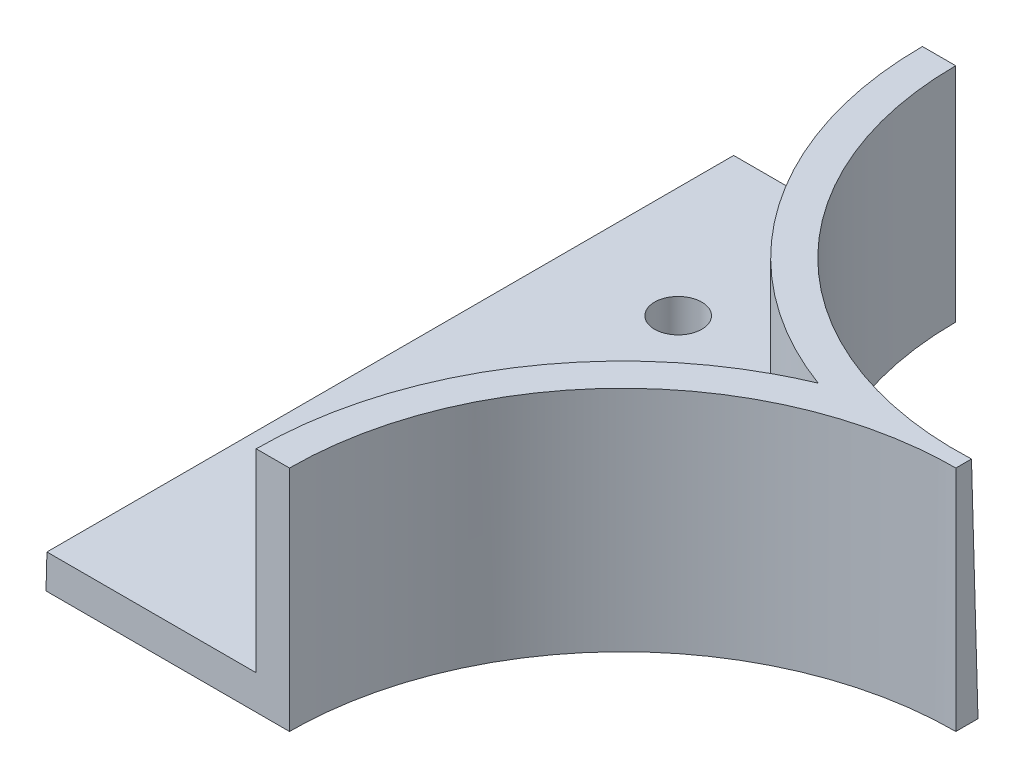
ISO-10303-21;
HEADER;
FILE_DESCRIPTION(('STEP AP214'),'2;1');
FILE_NAME('part.step','',(''),(''),'','','');
FILE_SCHEMA(('AUTOMOTIVE_DESIGN { 1 0 10303 214 1 1 1 1 }'));
ENDSEC;
DATA;
#1=APPLICATION_CONTEXT('core data for automotive mechanical design processes');
#2=APPLICATION_PROTOCOL_DEFINITION('international standard','automotive_design',2000,#1);
#3=PRODUCT_CONTEXT('',#1,'mechanical');
#4=PRODUCT('Part','Part','',(#3));
#5=PRODUCT_RELATED_PRODUCT_CATEGORY('part','',(#4));
#6=PRODUCT_DEFINITION_FORMATION('','',#4);
#7=PRODUCT_DEFINITION_CONTEXT('part definition',#1,'design');
#8=PRODUCT_DEFINITION('design','',#6,#7);
#9=PRODUCT_DEFINITION_SHAPE('','',#8);
#10=(LENGTH_UNIT() NAMED_UNIT(*) SI_UNIT(.MILLI.,.METRE.));
#11=(NAMED_UNIT(*) PLANE_ANGLE_UNIT() SI_UNIT($,.RADIAN.));
#12=(NAMED_UNIT(*) SI_UNIT($,.STERADIAN.) SOLID_ANGLE_UNIT());
#13=UNCERTAINTY_MEASURE_WITH_UNIT(LENGTH_MEASURE(1.E-05),#10,'distance_accuracy_value','');
#14=(GEOMETRIC_REPRESENTATION_CONTEXT(3) GLOBAL_UNCERTAINTY_ASSIGNED_CONTEXT((#13)) GLOBAL_UNIT_ASSIGNED_CONTEXT((#10,
#11,#12)) REPRESENTATION_CONTEXT('',''));
#15=CARTESIAN_POINT('',(0.,0.,0.));
#16=DIRECTION('',(0.,0.,1.));
#17=DIRECTION('',(1.,0.,0.));
#18=AXIS2_PLACEMENT_3D('',#15,#16,#17);
#19=CARTESIAN_POINT('',(0.,70.,-30.));
#20=DIRECTION('',(1.,0.,0.));
#21=DIRECTION('',(0.,0.,-1.));
#22=AXIS2_PLACEMENT_3D('',#19,#20,#21);
#23=PLANE('',#22);
#24=DIRECTION('',(0.,0.,1.));
#25=VECTOR('',#24,1.);
#26=CARTESIAN_POINT('',(0.,3.,-30.));
#27=LINE('',#26,#25);
#28=CARTESIAN_POINT('',(0.,3.,-30.));
#29=VERTEX_POINT('',#28);
#30=CARTESIAN_POINT('',(0.,3.,31.8609469555459));
#31=VERTEX_POINT('',#30);
#32=EDGE_CURVE('E206',#29,#31,#27,.T.);
#33=ORIENTED_EDGE('',*,*,#32,.F.);
#34=DIRECTION('',(0.,-1.,0.));
#35=VECTOR('',#34,1.);
#36=CARTESIAN_POINT('',(0.,70.,-30.));
#37=LINE('',#36,#35);
#38=CARTESIAN_POINT('',(0.,0.,-30.));
#39=VERTEX_POINT('',#38);
#40=EDGE_CURVE('E175',#29,#39,#37,.T.);
#41=ORIENTED_EDGE('',*,*,#40,.T.);
#42=DIRECTION('',(0.,0.,1.));
#43=VECTOR('',#42,1.);
#44=CARTESIAN_POINT('',(0.,0.,-30.));
#45=LINE('',#44,#43);
#46=CARTESIAN_POINT('',(0.,0.,31.94427293863));
#47=VERTEX_POINT('',#46);
#48=EDGE_CURVE('E166',#39,#47,#45,.T.);
#49=ORIENTED_EDGE('',*,*,#48,.T.);
#50=DIRECTION('',(0.,0.999614488628896,-0.027764619990052));
#51=VECTOR('',#50,1.);
#52=CARTESIAN_POINT('',(0.,70.,30.));
#53=LINE('',#52,#51);
#54=EDGE_CURVE('E179',#31,#47,#53,.F.);
#55=ORIENTED_EDGE('',*,*,#54,.F.);
#56=EDGE_LOOP('',(#33,#41,#49,#55));
#57=FACE_BOUND('',#56,.T.);
#58=ADVANCED_FACE('F39',(#57),#23,.F.);
#59=CARTESIAN_POINT('',(0.,70.,30.));
#60=DIRECTION('',(0.,0.027764619990052,0.999614488628895));
#61=DIRECTION('',(0.,-0.999614488628896,0.027764619990052));
#62=AXIS2_PLACEMENT_3D('',#59,#60,#61);
#63=PLANE('',#62);
#64=DIRECTION('',(0.0277539246596747,-0.999229422771352,0.0277539246596747));
#65=VECTOR('',#64,1.);
#66=CARTESIAN_POINT('',(16.9572042246286,71.0829324137406,29.9699211973371));
#67=LINE('',#66,#65);
#68=CARTESIAN_POINT('',(18.8482299828374,3.,31.8609469555459));
#69=VERTEX_POINT('',#68);
#70=CARTESIAN_POINT('',(18.3760494120272,20.,31.3887663847357));
#71=VERTEX_POINT('',#70);
#72=EDGE_CURVE('E129',#69,#71,#67,.F.);
#73=ORIENTED_EDGE('',*,*,#72,.F.);
#74=DIRECTION('',(-1.,0.,0.));
#75=VECTOR('',#74,1.);
#76=CARTESIAN_POINT('',(0.,3.,31.8609469555459));
#77=LINE('',#76,#75);
#78=EDGE_CURVE('E203',#31,#69,#77,.F.);
#79=ORIENTED_EDGE('',*,*,#78,.F.);
#80=ORIENTED_EDGE('',*,*,#54,.T.);
#81=DIRECTION('',(-1.,0.,0.));
#82=VECTOR('',#81,1.);
#83=CARTESIAN_POINT('',(0.,0.,31.94427293863));
#84=LINE('',#83,#82);
#85=CARTESIAN_POINT('',(21.9327120543496,0.,31.94427293863));
#86=VERTEX_POINT('',#85);
#87=EDGE_CURVE('E170',#47,#86,#84,.F.);
#88=ORIENTED_EDGE('',*,*,#87,.T.);
#89=DIRECTION('',(0.0277539246596747,-0.999229422771352,0.0277539246596747));
#90=VECTOR('',#89,1.);
#91=CARTESIAN_POINT('',(19.9560485815425,71.1661620893589,29.9676094658229));
#92=LINE('',#91,#90);
#93=CARTESIAN_POINT('',(21.3772055004553,20.,31.3887663847357));
#94=VERTEX_POINT('',#93);
#95=EDGE_CURVE('E162',#86,#94,#92,.F.);
#96=ORIENTED_EDGE('',*,*,#95,.T.);
#97=DIRECTION('',(-1.,0.,0.));
#98=VECTOR('',#97,1.);
#99=CARTESIAN_POINT('',(51.94427293863,20.,31.3887663847357));
#100=LINE('',#99,#98);
#101=EDGE_CURVE('E134',#94,#71,#100,.T.);
#102=ORIENTED_EDGE('',*,*,#101,.T.);
#103=EDGE_LOOP('',(#73,#79,#80,#88,#96,#102));
#104=FACE_BOUND('',#103,.T.);
#105=ADVANCED_FACE('F41',(#104),#63,.T.);
#106=CARTESIAN_POINT('',(0.,70.,-30.));
#107=DIRECTION('',(0.,0.,1.));
#108=DIRECTION('',(1.,0.,0.));
#109=AXIS2_PLACEMENT_3D('',#106,#107,#108);
#110=PLANE('',#109);
#111=DIRECTION('',(0.,1.,0.));
#112=VECTOR('',#111,1.);
#113=CARTESIAN_POINT('',(17.,20.,-30.));
#114=LINE('',#113,#112);
#115=CARTESIAN_POINT('',(17.,20.,-30.));
#116=VERTEX_POINT('',#115);
#117=CARTESIAN_POINT('',(17.,3.,-30.));
#118=VERTEX_POINT('',#117);
#119=EDGE_CURVE('E113',#116,#118,#114,.F.);
#120=ORIENTED_EDGE('',*,*,#119,.F.);
#121=DIRECTION('',(-1.,0.,0.));
#122=VECTOR('',#121,1.);
#123=CARTESIAN_POINT('',(51.94427293863,20.,-30.));
#124=LINE('',#123,#122);
#125=CARTESIAN_POINT('',(20.,20.,-30.));
#126=VERTEX_POINT('',#125);
#127=EDGE_CURVE('E124',#126,#116,#124,.T.);
#128=ORIENTED_EDGE('',*,*,#127,.F.);
#129=DIRECTION('',(0.,1.,0.));
#130=VECTOR('',#129,1.);
#131=CARTESIAN_POINT('',(20.,0.,-30.));
#132=LINE('',#131,#130);
#133=CARTESIAN_POINT('',(20.,0.,-30.));
#134=VERTEX_POINT('',#133);
#135=EDGE_CURVE('E156',#126,#134,#132,.F.);
#136=ORIENTED_EDGE('',*,*,#135,.T.);
#137=DIRECTION('',(-1.,0.,0.));
#138=VECTOR('',#137,1.);
#139=CARTESIAN_POINT('',(0.,0.,-30.));
#140=LINE('',#139,#138);
#141=EDGE_CURVE('E171',#134,#39,#140,.T.);
#142=ORIENTED_EDGE('',*,*,#141,.T.);
#143=ORIENTED_EDGE('',*,*,#40,.F.);
#144=DIRECTION('',(-1.,0.,0.));
#145=VECTOR('',#144,1.);
#146=CARTESIAN_POINT('',(0.,3.,-30.));
#147=LINE('',#146,#145);
#148=EDGE_CURVE('E127',#118,#29,#147,.T.);
#149=ORIENTED_EDGE('',*,*,#148,.F.);
#150=EDGE_LOOP('',(#120,#128,#136,#142,#143,#149));
#151=FACE_BOUND('',#150,.T.);
#152=ADVANCED_FACE('F123',(#151),#110,.F.);
#153=CARTESIAN_POINT('',(50.,70.,-30.));
#154=DIRECTION('',(0.999614488628895,0.027764619990052,0.));
#155=DIRECTION('',(-0.027764619990052,0.999614488628896,0.));
#156=AXIS2_PLACEMENT_3D('',#153,#154,#155);
#157=PLANE('',#156);
#158=CARTESIAN_POINT('',(50.,70.,-30.));
#159=DIRECTION('',(0.999614488628895,0.027764619990052,0.));
#160=DIRECTION('',(-0.027764619990052,0.999614488628896,0.));
#161=AXIS2_PLACEMENT_3D('',#158,#159,#160);
#162=ELLIPSE('',#161,1080.51181722454,30.);
#163=CARTESIAN_POINT('',(51.94427293863,0.,-0.0630695838716479));
#164=VERTEX_POINT('',#163);
#165=CARTESIAN_POINT('',(51.3887663847357,20.,-0.032161774184844));
#166=VERTEX_POINT('',#165);
#167=EDGE_CURVE('E152',#164,#166,#162,.F.);
#168=ORIENTED_EDGE('',*,*,#167,.T.);
#169=DIRECTION('',(0.,0.,-1.));
#170=VECTOR('',#169,1.);
#171=CARTESIAN_POINT('',(51.3887663847357,20.,-30.));
#172=LINE('',#171,#170);
#173=CARTESIAN_POINT('',(51.3887663847357,20.,1.37720550045528));
#174=VERTEX_POINT('',#173);
#175=EDGE_CURVE('E63',#166,#174,#172,.F.);
#176=ORIENTED_EDGE('',*,*,#175,.T.);
#177=DIRECTION('',(0.0277539246596747,-0.999229422771352,0.0277539246596747));
#178=VECTOR('',#177,1.);
#179=CARTESIAN_POINT('',(49.9676094658229,71.1661620893589,-0.0439514184575433));
#180=LINE('',#179,#178);
#181=CARTESIAN_POINT('',(51.94427293863,0.,1.93271205434955));
#182=VERTEX_POINT('',#181);
#183=EDGE_CURVE('E159',#174,#182,#180,.T.);
#184=ORIENTED_EDGE('',*,*,#183,.T.);
#185=DIRECTION('',(0.,0.,1.));
#186=VECTOR('',#185,1.);
#187=CARTESIAN_POINT('',(51.94427293863,0.,-30.));
#188=LINE('',#187,#186);
#189=EDGE_CURVE('E176',#182,#164,#188,.F.);
#190=ORIENTED_EDGE('',*,*,#189,.T.);
#191=EDGE_LOOP('',(#168,#176,#184,#190));
#192=FACE_BOUND('',#191,.T.);
#193=ADVANCED_FACE('F211',(#192),#157,.T.);
#194=CARTESIAN_POINT('',(0.,0.,0.));
#195=DIRECTION('',(0.,1.,0.));
#196=DIRECTION('',(0.,0.,1.));
#197=AXIS2_PLACEMENT_3D('',#194,#195,#196);
#198=PLANE('',#197);
#199=CARTESIAN_POINT('',(10.,0.,-15.));
#200=DIRECTION('',(0.,1.,0.));
#201=DIRECTION('',(0.,0.,1.));
#202=AXIS2_PLACEMENT_3D('',#199,#200,#201);
#203=CIRCLE('',#202,2.125);
#204=CARTESIAN_POINT('',(10.,0.,-12.875));
#205=VERTEX_POINT('',#204);
#206=EDGE_CURVE('E220',#205,#205,#203,.T.);
#207=ORIENTED_EDGE('',*,*,#206,.T.);
#208=EDGE_LOOP('',(#207));
#209=FACE_BOUND('',#208,.T.);
#210=CARTESIAN_POINT('',(10.,0.,15.));
#211=DIRECTION('',(0.,1.,0.));
#212=DIRECTION('',(0.,0.,-1.));
#213=AXIS2_PLACEMENT_3D('',#210,#211,#212);
#214=CIRCLE('',#213,2.125);
#215=CARTESIAN_POINT('',(10.,0.,12.875));
#216=VERTEX_POINT('',#215);
#217=EDGE_CURVE('E343',#216,#216,#214,.T.);
#218=ORIENTED_EDGE('',*,*,#217,.T.);
#219=EDGE_LOOP('',(#218));
#220=FACE_BOUND('',#219,.T.);
#221=ORIENTED_EDGE('',*,*,#141,.F.);
#222=CARTESIAN_POINT('',(50.,0.,-30.));
#223=DIRECTION('',(0.,1.,0.));
#224=DIRECTION('',(0.,0.,1.));
#225=AXIS2_PLACEMENT_3D('',#222,#223,#224);
#226=CIRCLE('',#225,30.);
#227=EDGE_CURVE('E148',#134,#164,#226,.T.);
#228=ORIENTED_EDGE('',*,*,#227,.T.);
#229=ORIENTED_EDGE('',*,*,#189,.F.);
#230=CARTESIAN_POINT('',(51.94427293863,0.,31.94427293863));
#231=DIRECTION('',(0.,1.,0.));
#232=DIRECTION('',(0.707106781186548,0.,0.707106781186547));
#233=AXIS2_PLACEMENT_3D('',#230,#231,#232);
#234=ELLIPSE('',#233,30.0231351442748,30.);
#235=EDGE_CURVE('E48',#182,#86,#234,.T.);
#236=ORIENTED_EDGE('',*,*,#235,.T.);
#237=ORIENTED_EDGE('',*,*,#87,.F.);
#238=ORIENTED_EDGE('',*,*,#48,.F.);
#239=EDGE_LOOP('',(#221,#228,#229,#236,#237,#238));
#240=FACE_BOUND('',#239,.T.);
#241=ADVANCED_FACE('F194',(#209,#220,#240),#198,.F.);
#242=CARTESIAN_POINT('',(49.9444921506807,71.9984588455427,29.9444921506807));
#243=DIRECTION('',(0.0277539246596747,-0.999229422771352,0.0277539246596747));
#244=DIRECTION('',(0.999614488628895,0.027764619990052,0.));
#245=AXIS2_PLACEMENT_3D('',#242,#243,#244);
#246=CYLINDRICAL_SURFACE('',#245,30.);
#247=ORIENTED_EDGE('',*,*,#183,.F.);
#248=CARTESIAN_POINT('',(51.3887663847357,20.,31.3887663847357));
#249=DIRECTION('',(0.,-1.,0.));
#250=DIRECTION('',(0.707106781186548,0.,0.707106781186547));
#251=AXIS2_PLACEMENT_3D('',#248,#249,#250);
#252=ELLIPSE('',#251,30.0231351442748,30.);
#253=EDGE_CURVE('E144',#174,#94,#252,.F.);
#254=ORIENTED_EDGE('',*,*,#253,.T.);
#255=ORIENTED_EDGE('',*,*,#95,.F.);
#256=ORIENTED_EDGE('',*,*,#235,.F.);
#257=EDGE_LOOP('',(#247,#254,#255,#256));
#258=FACE_BOUND('',#257,.T.);
#259=ADVANCED_FACE('F212',(#258),#246,.F.);
#260=CARTESIAN_POINT('',(50.,0.,-30.));
#261=DIRECTION('',(0.,1.,0.));
#262=DIRECTION('',(0.,0.,1.));
#263=AXIS2_PLACEMENT_3D('',#260,#261,#262);
#264=CYLINDRICAL_SURFACE('',#263,30.);
#265=ORIENTED_EDGE('',*,*,#135,.F.);
#266=CARTESIAN_POINT('',(50.,20.,-30.));
#267=DIRECTION('',(0.,-1.,0.));
#268=DIRECTION('',(0.,0.,-1.));
#269=AXIS2_PLACEMENT_3D('',#266,#267,#268);
#270=CIRCLE('',#269,30.);
#271=EDGE_CURVE('E11',#126,#166,#270,.F.);
#272=ORIENTED_EDGE('',*,*,#271,.T.);
#273=ORIENTED_EDGE('',*,*,#167,.F.);
#274=ORIENTED_EDGE('',*,*,#227,.F.);
#275=EDGE_LOOP('',(#265,#272,#273,#274));
#276=FACE_BOUND('',#275,.T.);
#277=ADVANCED_FACE('F209',(#276),#264,.F.);
#278=CARTESIAN_POINT('',(51.94427293863,20.,-30.));
#279=DIRECTION('',(0.,-1.,0.));
#280=DIRECTION('',(0.,0.,-1.));
#281=AXIS2_PLACEMENT_3D('',#278,#279,#280);
#282=PLANE('',#281);
#283=CARTESIAN_POINT('',(50.,20.,-30.));
#284=DIRECTION('',(0.,-1.,0.));
#285=DIRECTION('',(0.,0.,-1.));
#286=AXIS2_PLACEMENT_3D('',#283,#284,#285);
#287=CIRCLE('',#286,33.);
#288=CARTESIAN_POINT('',(38.569029167421,20.,0.956952463456853));
#289=VERTEX_POINT('',#288);
#290=EDGE_CURVE('E109',#116,#289,#287,.F.);
#291=ORIENTED_EDGE('',*,*,#290,.T.);
#292=CARTESIAN_POINT('',(51.3887663847357,20.,31.3887663847357));
#293=DIRECTION('',(0.,-1.,0.));
#294=DIRECTION('',(0.707106781186548,0.,0.707106781186547));
#295=AXIS2_PLACEMENT_3D('',#292,#293,#294);
#296=ELLIPSE('',#295,33.0254486587023,33.);
#297=EDGE_CURVE('E55',#289,#71,#296,.F.);
#298=ORIENTED_EDGE('',*,*,#297,.T.);
#299=ORIENTED_EDGE('',*,*,#101,.F.);
#300=ORIENTED_EDGE('',*,*,#253,.F.);
#301=ORIENTED_EDGE('',*,*,#175,.F.);
#302=ORIENTED_EDGE('',*,*,#271,.F.);
#303=ORIENTED_EDGE('',*,*,#127,.T.);
#304=EDGE_LOOP('',(#291,#298,#299,#300,#301,#302,#303));
#305=FACE_BOUND('',#304,.T.);
#306=ADVANCED_FACE('F132',(#305),#282,.F.);
#307=CARTESIAN_POINT('',(0.,3.,0.));
#308=DIRECTION('',(0.,1.,0.));
#309=DIRECTION('',(0.,0.,1.));
#310=AXIS2_PLACEMENT_3D('',#307,#308,#309);
#311=PLANE('',#310);
#312=CARTESIAN_POINT('',(10.,3.,-15.));
#313=DIRECTION('',(0.,1.,0.));
#314=DIRECTION('',(0.,0.,1.));
#315=AXIS2_PLACEMENT_3D('',#312,#313,#314);
#316=CIRCLE('',#315,2.125);
#317=CARTESIAN_POINT('',(10.,3.,-12.875));
#318=VERTEX_POINT('',#317);
#319=EDGE_CURVE('E345',#318,#318,#316,.T.);
#320=ORIENTED_EDGE('',*,*,#319,.F.);
#321=EDGE_LOOP('',(#320));
#322=FACE_BOUND('',#321,.T.);
#323=CARTESIAN_POINT('',(10.,3.,15.));
#324=DIRECTION('',(0.,1.,0.));
#325=DIRECTION('',(0.,0.,-1.));
#326=AXIS2_PLACEMENT_3D('',#323,#324,#325);
#327=CIRCLE('',#326,2.125);
#328=CARTESIAN_POINT('',(10.,3.,12.875));
#329=VERTEX_POINT('',#328);
#330=EDGE_CURVE('E346',#329,#329,#327,.T.);
#331=ORIENTED_EDGE('',*,*,#330,.F.);
#332=EDGE_LOOP('',(#331));
#333=FACE_BOUND('',#332,.T.);
#334=ORIENTED_EDGE('',*,*,#148,.T.);
#335=ORIENTED_EDGE('',*,*,#32,.T.);
#336=ORIENTED_EDGE('',*,*,#78,.T.);
#337=CARTESIAN_POINT('',(51.8609469555459,3.,31.8609469555459));
#338=DIRECTION('',(0.,1.,0.));
#339=DIRECTION('',(0.707106781186548,0.,0.707106781186547));
#340=AXIS2_PLACEMENT_3D('',#337,#338,#339);
#341=ELLIPSE('',#340,33.0254486587023,33.);
#342=CARTESIAN_POINT('',(39.4395605772001,3.,1.26463048234175));
#343=VERTEX_POINT('',#342);
#344=EDGE_CURVE('E118',#343,#69,#341,.T.);
#345=ORIENTED_EDGE('',*,*,#344,.F.);
#346=CARTESIAN_POINT('',(50.,3.,-30.));
#347=DIRECTION('',(0.,1.,0.));
#348=DIRECTION('',(0.,0.,1.));
#349=AXIS2_PLACEMENT_3D('',#346,#347,#348);
#350=CIRCLE('',#349,33.);
#351=EDGE_CURVE('E130',#118,#343,#350,.T.);
#352=ORIENTED_EDGE('',*,*,#351,.F.);
#353=EDGE_LOOP('',(#334,#335,#336,#345,#352));
#354=FACE_BOUND('',#353,.T.);
#355=ADVANCED_FACE('F233',(#322,#333,#354),#311,.T.);
#356=CARTESIAN_POINT('',(49.9444921506807,71.9984588455427,29.9444921506807));
#357=DIRECTION('',(0.0277539246596747,-0.999229422771352,0.0277539246596747));
#358=DIRECTION('',(0.999614488628895,0.027764619990052,0.));
#359=AXIS2_PLACEMENT_3D('',#356,#357,#358);
#360=CYLINDRICAL_SURFACE('',#359,33.);
#361=CARTESIAN_POINT('',(36.8923578610607,55.1423234384893,0.285140210299553));
#362=CARTESIAN_POINT('',(37.1598762357109,49.2847634242022,0.400883236545503));
#363=CARTESIAN_POINT('',(37.4327634872355,43.4274093169415,0.514822357449192));
#364=CARTESIAN_POINT('',(37.9910589767311,31.7132641985077,0.738842820306436));
#365=CARTESIAN_POINT('',(38.2764671305619,25.8564731838156,0.848924188175089));
#366=CARTESIAN_POINT('',(38.8615917291104,14.1435163101906,1.06498093253177));
#367=CARTESIAN_POINT('',(39.1613081994949,8.28735045239816,1.17095630165365));
#368=CARTESIAN_POINT('',(39.623513308899,-0.496311713187033,1.32658503920678));
#369=CARTESIAN_POINT('',(39.7796873004887,-3.4241113214524,1.3779057351422));
#370=CARTESIAN_POINT('',(40.0966591924833,-9.27948169674609,1.47938158736448));
#371=CARTESIAN_POINT('',(40.257457095062,-12.2070524636662,1.52953674310334));
#372=CARTESIAN_POINT('',(40.4207739136212,-15.1344941147113,1.57908212070198));
#373=B_SPLINE_CURVE_WITH_KNOTS('',3,(#361,#362,#363,#364,#365,#366,#367,#368,#369,#370,#371,
#372),.UNSPECIFIED.,.F.,.F.,(4,2,2,2,2,4),(0.,17.5944261239991,35.1887340318461,
52.7830735023221,61.5803032776902,70.3775371892458),.UNSPECIFIED.);
#374=EDGE_CURVE('E115',#289,#343,#373,.T.);
#375=ORIENTED_EDGE('',*,*,#374,.T.);
#376=ORIENTED_EDGE('',*,*,#344,.T.);
#377=ORIENTED_EDGE('',*,*,#72,.T.);
#378=ORIENTED_EDGE('',*,*,#297,.F.);
#379=EDGE_LOOP('',(#375,#376,#377,#378));
#380=FACE_BOUND('',#379,.T.);
#381=ADVANCED_FACE('F229',(#380),#360,.T.);
#382=CARTESIAN_POINT('',(50.,0.,-30.));
#383=DIRECTION('',(0.,1.,0.));
#384=DIRECTION('',(0.,0.,1.));
#385=AXIS2_PLACEMENT_3D('',#382,#383,#384);
#386=CYLINDRICAL_SURFACE('',#385,33.);
#387=ORIENTED_EDGE('',*,*,#290,.F.);
#388=ORIENTED_EDGE('',*,*,#119,.T.);
#389=ORIENTED_EDGE('',*,*,#351,.T.);
#390=ORIENTED_EDGE('',*,*,#374,.F.);
#391=EDGE_LOOP('',(#387,#388,#389,#390));
#392=FACE_BOUND('',#391,.T.);
#393=ADVANCED_FACE('F111',(#392),#386,.T.);
#394=CARTESIAN_POINT('',(10.,0.,15.));
#395=DIRECTION('',(0.,1.,0.));
#396=DIRECTION('',(0.,0.,1.));
#397=AXIS2_PLACEMENT_3D('',#394,#395,#396);
#398=CYLINDRICAL_SURFACE('',#397,2.125);
#399=ORIENTED_EDGE('',*,*,#217,.F.);
#400=EDGE_LOOP('',(#399));
#401=FACE_BOUND('',#400,.T.);
#402=ORIENTED_EDGE('',*,*,#330,.T.);
#403=EDGE_LOOP('',(#402));
#404=FACE_BOUND('',#403,.T.);
#405=ADVANCED_FACE('F237',(#401,#404),#398,.F.);
#406=CARTESIAN_POINT('',(10.,0.,-15.));
#407=DIRECTION('',(0.,1.,0.));
#408=DIRECTION('',(0.,0.,1.));
#409=AXIS2_PLACEMENT_3D('',#406,#407,#408);
#410=CYLINDRICAL_SURFACE('',#409,2.125);
#411=ORIENTED_EDGE('',*,*,#206,.F.);
#412=EDGE_LOOP('',(#411));
#413=FACE_BOUND('',#412,.T.);
#414=ORIENTED_EDGE('',*,*,#319,.T.);
#415=EDGE_LOOP('',(#414));
#416=FACE_BOUND('',#415,.T.);
#417=ADVANCED_FACE('F240',(#413,#416),#410,.F.);
#418=CLOSED_SHELL('',(#58,#105,#152,#193,#241,#259,#277,#306,#355,#381,#393,#405,#417));
#419=MANIFOLD_SOLID_BREP('B2',#418);
#420=ADVANCED_BREP_SHAPE_REPRESENTATION('',(#18,#419),#14);
#421=SHAPE_DEFINITION_REPRESENTATION(#9,#420);
ENDSEC;
END-ISO-10303-21;
